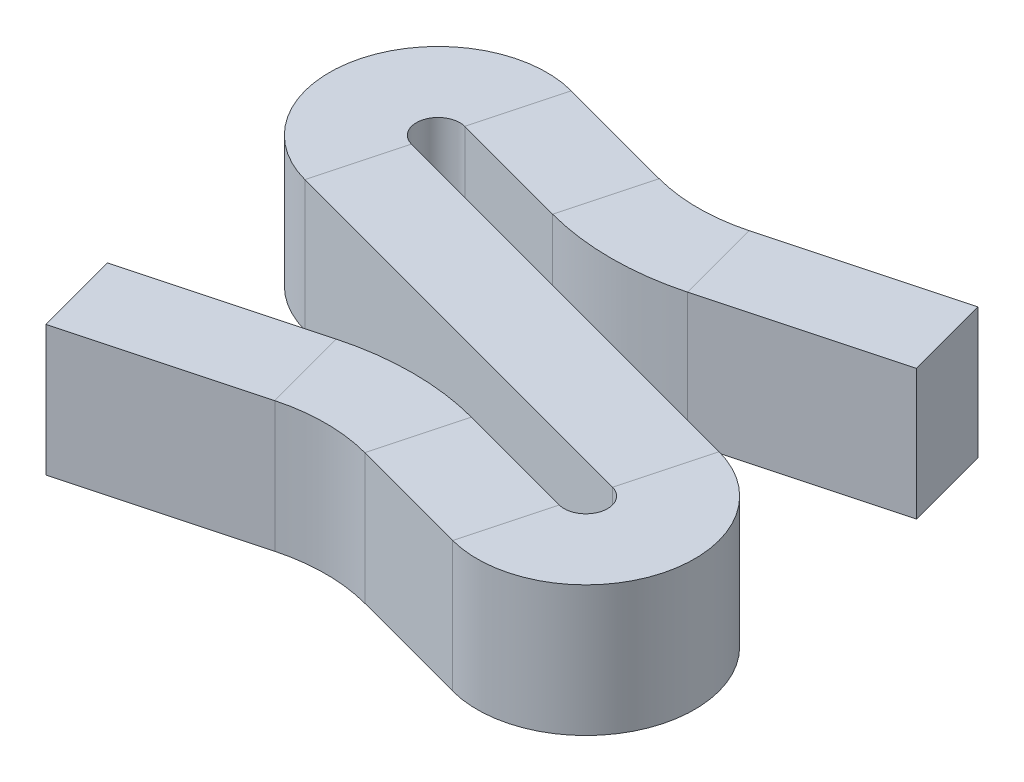
ISO-10303-21;
HEADER;
FILE_DESCRIPTION(('STEP AP214'),'2;1');
FILE_NAME('part.step','',(''),(''),'','','');
FILE_SCHEMA(('AUTOMOTIVE_DESIGN { 1 0 10303 214 1 1 1 1 }'));
ENDSEC;
DATA;
#1=APPLICATION_CONTEXT('core data for automotive mechanical design processes');
#2=APPLICATION_PROTOCOL_DEFINITION('international standard','automotive_design',2000,#1);
#3=PRODUCT_CONTEXT('',#1,'mechanical');
#4=PRODUCT('Part','Part','',(#3));
#5=PRODUCT_RELATED_PRODUCT_CATEGORY('part','',(#4));
#6=PRODUCT_DEFINITION_FORMATION('','',#4);
#7=PRODUCT_DEFINITION_CONTEXT('part definition',#1,'design');
#8=PRODUCT_DEFINITION('design','',#6,#7);
#9=PRODUCT_DEFINITION_SHAPE('','',#8);
#10=(LENGTH_UNIT() NAMED_UNIT(*) SI_UNIT(.MILLI.,.METRE.));
#11=(NAMED_UNIT(*) PLANE_ANGLE_UNIT() SI_UNIT($,.RADIAN.));
#12=(NAMED_UNIT(*) SI_UNIT($,.STERADIAN.) SOLID_ANGLE_UNIT());
#13=UNCERTAINTY_MEASURE_WITH_UNIT(LENGTH_MEASURE(1.E-05),#10,'distance_accuracy_value','');
#14=(GEOMETRIC_REPRESENTATION_CONTEXT(3) GLOBAL_UNCERTAINTY_ASSIGNED_CONTEXT((#13)) GLOBAL_UNIT_ASSIGNED_CONTEXT((#10,
#11,#12)) REPRESENTATION_CONTEXT('',''));
#15=CARTESIAN_POINT('',(0.,0.,0.));
#16=DIRECTION('',(0.,0.,1.));
#17=DIRECTION('',(1.,0.,0.));
#18=AXIS2_PLACEMENT_3D('',#15,#16,#17);
#19=CARTESIAN_POINT('',(4.66494342848403,0.,-7.46162490685962));
#20=DIRECTION('',(0.96592582628907,0.,-0.258819045102515));
#21=DIRECTION('',(-0.258819045102515,0.,-0.96592582628907));
#22=AXIS2_PLACEMENT_3D('',#19,#20,#21);
#23=PLANE('',#22);
#24=DIRECTION('',(0.,1.,0.));
#25=VECTOR('',#24,1.);
#26=CARTESIAN_POINT('',(5.70021960889409,-1.5,-3.59792160170334));
#27=LINE('',#26,#25);
#28=CARTESIAN_POINT('',(5.70021960889409,-1.5,-3.59792160170334));
#29=VERTEX_POINT('',#28);
#30=CARTESIAN_POINT('',(5.70021960889409,1.5,-3.59792160170334));
#31=VERTEX_POINT('',#30);
#32=EDGE_CURVE('E188',#29,#31,#27,.T.);
#33=ORIENTED_EDGE('',*,*,#32,.F.);
#34=DIRECTION('',(0.258819045102515,0.,0.96592582628907));
#35=VECTOR('',#34,1.);
#36=CARTESIAN_POINT('',(5.18258151868906,-1.5,-5.52977325428148));
#37=LINE('',#36,#35);
#38=CARTESIAN_POINT('',(5.18258151868906,-1.5,-5.52977325428148));
#39=VERTEX_POINT('',#38);
#40=EDGE_CURVE('E190',#39,#29,#37,.T.);
#41=ORIENTED_EDGE('',*,*,#40,.F.);
#42=DIRECTION('',(0.,-1.,0.));
#43=VECTOR('',#42,1.);
#44=CARTESIAN_POINT('',(5.18258151868906,-1.5,-5.52977325428148));
#45=LINE('',#44,#43);
#46=CARTESIAN_POINT('',(5.18258151868906,1.5,-5.52977325428148));
#47=VERTEX_POINT('',#46);
#48=EDGE_CURVE('E207',#47,#39,#45,.T.);
#49=ORIENTED_EDGE('',*,*,#48,.F.);
#50=DIRECTION('',(-0.258819045102515,0.,-0.96592582628907));
#51=VECTOR('',#50,1.);
#52=CARTESIAN_POINT('',(5.18258151868906,1.5,-5.52977325428148));
#53=LINE('',#52,#51);
#54=EDGE_CURVE('E193',#31,#47,#53,.T.);
#55=ORIENTED_EDGE('',*,*,#54,.F.);
#56=EDGE_LOOP('',(#33,#41,#49,#55));
#57=FACE_BOUND('',#56,.T.);
#58=ADVANCED_FACE('F32',(#57),#23,.T.);
#59=CARTESIAN_POINT('',(-6.21785769909912,0.,1.66606994912521));
#60=DIRECTION('',(0.96592582628907,0.,-0.258819045102515));
#61=DIRECTION('',(-0.258819045102515,0.,-0.96592582628907));
#62=AXIS2_PLACEMENT_3D('',#59,#60,#61);
#63=PLANE('',#62);
#64=DIRECTION('',(0.,1.,0.));
#65=VECTOR('',#64,1.);
#66=CARTESIAN_POINT('',(-5.18258151868906,-1.5,5.52977325428149));
#67=LINE('',#66,#65);
#68=CARTESIAN_POINT('',(-5.18258151868906,-1.5,5.52977325428149));
#69=VERTEX_POINT('',#68);
#70=CARTESIAN_POINT('',(-5.18258151868906,1.5,5.52977325428149));
#71=VERTEX_POINT('',#70);
#72=EDGE_CURVE('E293',#69,#71,#67,.T.);
#73=ORIENTED_EDGE('',*,*,#72,.T.);
#74=DIRECTION('',(-0.258819045102515,0.,-0.96592582628907));
#75=VECTOR('',#74,1.);
#76=CARTESIAN_POINT('',(-5.70021960889409,1.5,3.59792160170335));
#77=LINE('',#76,#75);
#78=CARTESIAN_POINT('',(-5.70021960889409,1.5,3.59792160170335));
#79=VERTEX_POINT('',#78);
#80=EDGE_CURVE('E51',#71,#79,#77,.T.);
#81=ORIENTED_EDGE('',*,*,#80,.T.);
#82=DIRECTION('',(0.,-1.,0.));
#83=VECTOR('',#82,1.);
#84=CARTESIAN_POINT('',(-5.70021960889409,-1.5,3.59792160170335));
#85=LINE('',#84,#83);
#86=CARTESIAN_POINT('',(-5.70021960889409,-1.5,3.59792160170335));
#87=VERTEX_POINT('',#86);
#88=EDGE_CURVE('E45',#79,#87,#85,.T.);
#89=ORIENTED_EDGE('',*,*,#88,.T.);
#90=DIRECTION('',(0.258819045102515,0.,0.96592582628907));
#91=VECTOR('',#90,1.);
#92=CARTESIAN_POINT('',(-5.70021960889409,-1.5,3.59792160170335));
#93=LINE('',#92,#91);
#94=EDGE_CURVE('E11',#87,#69,#93,.T.);
#95=ORIENTED_EDGE('',*,*,#94,.T.);
#96=EDGE_LOOP('',(#73,#81,#89,#95));
#97=FACE_BOUND('',#96,.T.);
#98=ADVANCED_FACE('F472',(#97),#63,.F.);
#99=CARTESIAN_POINT('',(5.70021960889409,-1.5,-3.59792160170334));
#100=DIRECTION('',(0.258819045102514,0.,0.96592582628907));
#101=DIRECTION('',(0.96592582628907,0.,-0.258819045102514));
#102=AXIS2_PLACEMENT_3D('',#99,#100,#101);
#103=PLANE('',#102);
#104=DIRECTION('',(-0.96592582628907,0.,0.258819045102514));
#105=VECTOR('',#104,1.);
#106=CARTESIAN_POINT('',(5.70021960889409,1.5,-3.59792160170334));
#107=LINE('',#106,#105);
#108=CARTESIAN_POINT('',(1.55291427061509,1.5,-2.48665448554623));
#109=VERTEX_POINT('',#108);
#110=EDGE_CURVE('E214',#31,#109,#107,.T.);
#111=ORIENTED_EDGE('',*,*,#110,.T.);
#112=DIRECTION('',(0.,1.,0.));
#113=VECTOR('',#112,1.);
#114=CARTESIAN_POINT('',(1.55291427061509,-1.5,-2.48665448554623));
#115=LINE('',#114,#113);
#116=CARTESIAN_POINT('',(1.55291427061509,-1.5,-2.48665448554623));
#117=VERTEX_POINT('',#116);
#118=EDGE_CURVE('E212',#117,#109,#115,.T.);
#119=ORIENTED_EDGE('',*,*,#118,.F.);
#120=DIRECTION('',(-0.96592582628907,0.,0.258819045102514));
#121=VECTOR('',#120,1.);
#122=CARTESIAN_POINT('',(5.70021960889409,-1.5,-3.59792160170334));
#123=LINE('',#122,#121);
#124=EDGE_CURVE('E204',#29,#117,#123,.T.);
#125=ORIENTED_EDGE('',*,*,#124,.F.);
#126=ORIENTED_EDGE('',*,*,#32,.T.);
#127=EDGE_LOOP('',(#111,#119,#125,#126));
#128=FACE_BOUND('',#127,.T.);
#129=ADVANCED_FACE('F210',(#128),#103,.T.);
#130=CARTESIAN_POINT('',(5.18258151868906,1.5,-5.52977325428148));
#131=DIRECTION('',(0.,1.,0.));
#132=DIRECTION('',(0.,0.,1.));
#133=AXIS2_PLACEMENT_3D('',#130,#131,#132);
#134=PLANE('',#133);
#135=DIRECTION('',(-0.96592582628907,0.,0.258819045102514));
#136=VECTOR('',#135,1.);
#137=CARTESIAN_POINT('',(5.18258151868906,1.5,-5.52977325428148));
#138=LINE('',#137,#136);
#139=CARTESIAN_POINT('',(1.03527618041006,1.5,-4.41850613812437));
#140=VERTEX_POINT('',#139);
#141=EDGE_CURVE('E304',#47,#140,#138,.T.);
#142=ORIENTED_EDGE('',*,*,#141,.T.);
#143=DIRECTION('',(-0.258819045102515,0.,-0.96592582628907));
#144=VECTOR('',#143,1.);
#145=CARTESIAN_POINT('',(1.03527618041006,1.5,-4.41850613812437));
#146=LINE('',#145,#144);
#147=EDGE_CURVE('E301',#109,#140,#146,.T.);
#148=ORIENTED_EDGE('',*,*,#147,.F.);
#149=ORIENTED_EDGE('',*,*,#110,.F.);
#150=ORIENTED_EDGE('',*,*,#54,.T.);
#151=EDGE_LOOP('',(#142,#148,#149,#150));
#152=FACE_BOUND('',#151,.T.);
#153=ADVANCED_FACE('F512',(#152),#134,.T.);
#154=CARTESIAN_POINT('',(5.18258151868906,-1.5,-5.52977325428148));
#155=DIRECTION('',(-0.258819045102514,0.,-0.96592582628907));
#156=DIRECTION('',(-0.96592582628907,0.,0.258819045102514));
#157=AXIS2_PLACEMENT_3D('',#154,#155,#156);
#158=PLANE('',#157);
#159=DIRECTION('',(-0.96592582628907,0.,0.258819045102514));
#160=VECTOR('',#159,1.);
#161=CARTESIAN_POINT('',(5.18258151868906,-1.5,-5.52977325428148));
#162=LINE('',#161,#160);
#163=CARTESIAN_POINT('',(1.03527618041006,-1.5,-4.41850613812437));
#164=VERTEX_POINT('',#163);
#165=EDGE_CURVE('E206',#39,#164,#162,.T.);
#166=ORIENTED_EDGE('',*,*,#165,.T.);
#167=DIRECTION('',(0.,-1.,0.));
#168=VECTOR('',#167,1.);
#169=CARTESIAN_POINT('',(1.03527618041006,-1.5,-4.41850613812437));
#170=LINE('',#169,#168);
#171=EDGE_CURVE('E307',#140,#164,#170,.T.);
#172=ORIENTED_EDGE('',*,*,#171,.F.);
#173=ORIENTED_EDGE('',*,*,#141,.F.);
#174=ORIENTED_EDGE('',*,*,#48,.T.);
#175=EDGE_LOOP('',(#166,#172,#173,#174));
#176=FACE_BOUND('',#175,.T.);
#177=ADVANCED_FACE('F445',(#176),#158,.T.);
#178=CARTESIAN_POINT('',(5.18258151868906,-1.5,-5.52977325428148));
#179=DIRECTION('',(0.,-1.,0.));
#180=DIRECTION('',(0.,0.,-1.));
#181=AXIS2_PLACEMENT_3D('',#178,#179,#180);
#182=PLANE('',#181);
#183=DIRECTION('',(0.258819045102515,0.,0.96592582628907));
#184=VECTOR('',#183,1.);
#185=CARTESIAN_POINT('',(1.03527618041006,-1.5,-4.41850613812437));
#186=LINE('',#185,#184);
#187=EDGE_CURVE('E228',#164,#117,#186,.T.);
#188=ORIENTED_EDGE('',*,*,#187,.F.);
#189=ORIENTED_EDGE('',*,*,#165,.F.);
#190=ORIENTED_EDGE('',*,*,#40,.T.);
#191=ORIENTED_EDGE('',*,*,#124,.T.);
#192=EDGE_LOOP('',(#188,#189,#190,#191));
#193=FACE_BOUND('',#192,.T.);
#194=ADVANCED_FACE('F203',(#193),#182,.T.);
#195=CARTESIAN_POINT('',(0.,0.,-8.28220944328065));
#196=DIRECTION('',(0.,-1.,0.));
#197=DIRECTION('',(0.,0.,-1.));
#198=AXIS2_PLACEMENT_3D('',#195,#196,#197);
#199=CYLINDRICAL_SURFACE('',#198,5.99999999999999);
#200=CARTESIAN_POINT('',(0.,1.5,-8.28220944328065));
#201=DIRECTION('',(0.,-1.,0.));
#202=DIRECTION('',(0.258819045102515,0.,0.96592582628907));
#203=AXIS2_PLACEMENT_3D('',#200,#201,#202);
#204=CIRCLE('',#203,5.99999999999999);
#205=CARTESIAN_POINT('',(-1.55291427061508,1.5,-2.48665448554624));
#206=VERTEX_POINT('',#205);
#207=EDGE_CURVE('E221',#109,#206,#204,.T.);
#208=ORIENTED_EDGE('',*,*,#207,.T.);
#209=DIRECTION('',(0.,1.,0.));
#210=VECTOR('',#209,1.);
#211=CARTESIAN_POINT('',(-1.55291427061509,-1.5,-2.48665448554623));
#212=LINE('',#211,#210);
#213=CARTESIAN_POINT('',(-1.55291427061508,-1.5,-2.48665448554624));
#214=VERTEX_POINT('',#213);
#215=EDGE_CURVE('E218',#214,#206,#212,.T.);
#216=ORIENTED_EDGE('',*,*,#215,.F.);
#217=CARTESIAN_POINT('',(0.,-1.5,-8.28220944328065));
#218=DIRECTION('',(0.,-1.,0.));
#219=DIRECTION('',(0.258819045102515,0.,0.96592582628907));
#220=AXIS2_PLACEMENT_3D('',#217,#218,#219);
#221=CIRCLE('',#220,5.99999999999999);
#222=EDGE_CURVE('E222',#117,#214,#221,.T.);
#223=ORIENTED_EDGE('',*,*,#222,.F.);
#224=ORIENTED_EDGE('',*,*,#118,.T.);
#225=EDGE_LOOP('',(#208,#216,#223,#224));
#226=FACE_BOUND('',#225,.T.);
#227=ADVANCED_FACE('F441',(#226),#199,.T.);
#228=CARTESIAN_POINT('',(1.03527618041005,1.5,-4.41850613812438));
#229=DIRECTION('',(0.,1.,0.));
#230=DIRECTION('',(0.,0.,1.));
#231=AXIS2_PLACEMENT_3D('',#228,#229,#230);
#232=PLANE('',#231);
#233=CARTESIAN_POINT('',(0.,1.5,-8.28220944328065));
#234=DIRECTION('',(0.,-1.,0.));
#235=DIRECTION('',(0.258819045102515,0.,0.96592582628907));
#236=AXIS2_PLACEMENT_3D('',#233,#234,#235);
#237=CIRCLE('',#236,3.99999999999999);
#238=CARTESIAN_POINT('',(-1.03527618041006,1.5,-4.41850613812438));
#239=VERTEX_POINT('',#238);
#240=EDGE_CURVE('E310',#140,#239,#237,.T.);
#241=ORIENTED_EDGE('',*,*,#240,.T.);
#242=DIRECTION('',(0.258819045102513,0.,-0.96592582628907));
#243=VECTOR('',#242,1.);
#244=CARTESIAN_POINT('',(-1.03527618041006,1.5,-4.41850613812437));
#245=LINE('',#244,#243);
#246=EDGE_CURVE('E225',#206,#239,#245,.T.);
#247=ORIENTED_EDGE('',*,*,#246,.F.);
#248=ORIENTED_EDGE('',*,*,#207,.F.);
#249=ORIENTED_EDGE('',*,*,#147,.T.);
#250=EDGE_LOOP('',(#241,#247,#248,#249));
#251=FACE_BOUND('',#250,.T.);
#252=ADVANCED_FACE('F452',(#251),#232,.T.);
#253=CARTESIAN_POINT('',(0.,0.,-8.28220944328065));
#254=DIRECTION('',(0.,-1.,0.));
#255=DIRECTION('',(0.,0.,-1.));
#256=AXIS2_PLACEMENT_3D('',#253,#254,#255);
#257=CYLINDRICAL_SURFACE('',#256,3.99999999999999);
#258=CARTESIAN_POINT('',(0.,-1.5,-8.28220944328065));
#259=DIRECTION('',(0.,-1.,0.));
#260=DIRECTION('',(0.258819045102515,0.,0.96592582628907));
#261=AXIS2_PLACEMENT_3D('',#258,#259,#260);
#262=CIRCLE('',#261,3.99999999999999);
#263=CARTESIAN_POINT('',(-1.03527618041006,-1.5,-4.41850613812438));
#264=VERTEX_POINT('',#263);
#265=EDGE_CURVE('E354',#164,#264,#262,.T.);
#266=ORIENTED_EDGE('',*,*,#265,.T.);
#267=DIRECTION('',(0.,-1.,0.));
#268=VECTOR('',#267,1.);
#269=CARTESIAN_POINT('',(-1.03527618041006,-1.5,-4.41850613812437));
#270=LINE('',#269,#268);
#271=EDGE_CURVE('E313',#239,#264,#270,.T.);
#272=ORIENTED_EDGE('',*,*,#271,.F.);
#273=ORIENTED_EDGE('',*,*,#240,.F.);
#274=ORIENTED_EDGE('',*,*,#171,.T.);
#275=EDGE_LOOP('',(#266,#272,#273,#274));
#276=FACE_BOUND('',#275,.T.);
#277=ADVANCED_FACE('F448',(#276),#257,.F.);
#278=CARTESIAN_POINT('',(1.03527618041005,-1.5,-4.41850613812438));
#279=DIRECTION('',(0.,-1.,0.));
#280=DIRECTION('',(0.,0.,-1.));
#281=AXIS2_PLACEMENT_3D('',#278,#279,#280);
#282=PLANE('',#281);
#283=DIRECTION('',(-0.258819045102513,0.,0.96592582628907));
#284=VECTOR('',#283,1.);
#285=CARTESIAN_POINT('',(-1.03527618041006,-1.5,-4.41850613812437));
#286=LINE('',#285,#284);
#287=EDGE_CURVE('E239',#264,#214,#286,.T.);
#288=ORIENTED_EDGE('',*,*,#287,.F.);
#289=ORIENTED_EDGE('',*,*,#265,.F.);
#290=ORIENTED_EDGE('',*,*,#187,.T.);
#291=ORIENTED_EDGE('',*,*,#222,.T.);
#292=EDGE_LOOP('',(#288,#289,#290,#291));
#293=FACE_BOUND('',#292,.T.);
#294=ADVANCED_FACE('F442',(#293),#282,.T.);
#295=CARTESIAN_POINT('',(-1.55291427061509,-1.5,-2.48665448554623));
#296=DIRECTION('',(-0.258819045102514,0.,0.96592582628907));
#297=DIRECTION('',(0.96592582628907,0.,0.258819045102514));
#298=AXIS2_PLACEMENT_3D('',#295,#296,#297);
#299=PLANE('',#298);
#300=DIRECTION('',(-0.96592582628907,0.,-0.258819045102514));
#301=VECTOR('',#300,1.);
#302=CARTESIAN_POINT('',(-1.55291427061509,1.5,-2.48665448554623));
#303=LINE('',#302,#301);
#304=CARTESIAN_POINT('',(-4.31199104124032,1.5,-3.22594687809071));
#305=VERTEX_POINT('',#304);
#306=EDGE_CURVE('E232',#206,#305,#303,.T.);
#307=ORIENTED_EDGE('',*,*,#306,.T.);
#308=DIRECTION('',(0.,1.,0.));
#309=VECTOR('',#308,1.);
#310=CARTESIAN_POINT('',(-4.31199104124032,-1.5,-3.22594687809071));
#311=LINE('',#310,#309);
#312=CARTESIAN_POINT('',(-4.31199104124032,-1.5,-3.22594687809071));
#313=VERTEX_POINT('',#312);
#314=EDGE_CURVE('E229',#313,#305,#311,.T.);
#315=ORIENTED_EDGE('',*,*,#314,.F.);
#316=DIRECTION('',(-0.96592582628907,0.,-0.258819045102514));
#317=VECTOR('',#316,1.);
#318=CARTESIAN_POINT('',(-1.55291427061509,-1.5,-2.48665448554623));
#319=LINE('',#318,#317);
#320=EDGE_CURVE('E233',#214,#313,#319,.T.);
#321=ORIENTED_EDGE('',*,*,#320,.F.);
#322=ORIENTED_EDGE('',*,*,#215,.T.);
#323=EDGE_LOOP('',(#307,#315,#321,#322));
#324=FACE_BOUND('',#323,.T.);
#325=ADVANCED_FACE('F435',(#324),#299,.T.);
#326=CARTESIAN_POINT('',(-1.03527618041006,1.5,-4.41850613812437));
#327=DIRECTION('',(0.,1.,0.));
#328=DIRECTION('',(0.,0.,1.));
#329=AXIS2_PLACEMENT_3D('',#326,#327,#328);
#330=PLANE('',#329);
#331=DIRECTION('',(-0.96592582628907,0.,-0.258819045102514));
#332=VECTOR('',#331,1.);
#333=CARTESIAN_POINT('',(-1.03527618041006,1.5,-4.41850613812437));
#334=LINE('',#333,#332);
#335=CARTESIAN_POINT('',(-3.7943529510353,1.5,-5.15779853066885));
#336=VERTEX_POINT('',#335);
#337=EDGE_CURVE('E316',#239,#336,#334,.T.);
#338=ORIENTED_EDGE('',*,*,#337,.T.);
#339=DIRECTION('',(0.258819045102513,0.,-0.96592582628907));
#340=VECTOR('',#339,1.);
#341=CARTESIAN_POINT('',(-3.7943529510353,1.5,-5.15779853066885));
#342=LINE('',#341,#340);
#343=EDGE_CURVE('E236',#305,#336,#342,.T.);
#344=ORIENTED_EDGE('',*,*,#343,.F.);
#345=ORIENTED_EDGE('',*,*,#306,.F.);
#346=ORIENTED_EDGE('',*,*,#246,.T.);
#347=EDGE_LOOP('',(#338,#344,#345,#346));
#348=FACE_BOUND('',#347,.T.);
#349=ADVANCED_FACE('F455',(#348),#330,.T.);
#350=CARTESIAN_POINT('',(-1.03527618041006,-1.5,-4.41850613812437));
#351=DIRECTION('',(0.258819045102514,0.,-0.96592582628907));
#352=DIRECTION('',(-0.96592582628907,0.,-0.258819045102514));
#353=AXIS2_PLACEMENT_3D('',#350,#351,#352);
#354=PLANE('',#353);
#355=DIRECTION('',(-0.96592582628907,0.,-0.258819045102514));
#356=VECTOR('',#355,1.);
#357=CARTESIAN_POINT('',(-1.03527618041006,-1.5,-4.41850613812437));
#358=LINE('',#357,#356);
#359=CARTESIAN_POINT('',(-3.7943529510353,-1.5,-5.15779853066885));
#360=VERTEX_POINT('',#359);
#361=EDGE_CURVE('E359',#264,#360,#358,.T.);
#362=ORIENTED_EDGE('',*,*,#361,.T.);
#363=DIRECTION('',(0.,-1.,0.));
#364=VECTOR('',#363,1.);
#365=CARTESIAN_POINT('',(-3.7943529510353,-1.5,-5.15779853066885));
#366=LINE('',#365,#364);
#367=EDGE_CURVE('E319',#336,#360,#366,.T.);
#368=ORIENTED_EDGE('',*,*,#367,.F.);
#369=ORIENTED_EDGE('',*,*,#337,.F.);
#370=ORIENTED_EDGE('',*,*,#271,.T.);
#371=EDGE_LOOP('',(#362,#368,#369,#370));
#372=FACE_BOUND('',#371,.T.);
#373=ADVANCED_FACE('F488',(#372),#354,.T.);
#374=CARTESIAN_POINT('',(-1.03527618041006,-1.5,-4.41850613812437));
#375=DIRECTION('',(0.,-1.,0.));
#376=DIRECTION('',(0.,0.,-1.));
#377=AXIS2_PLACEMENT_3D('',#374,#375,#376);
#378=PLANE('',#377);
#379=DIRECTION('',(-0.258819045102513,0.,0.96592582628907));
#380=VECTOR('',#379,1.);
#381=CARTESIAN_POINT('',(-3.7943529510353,-1.5,-5.15779853066885));
#382=LINE('',#381,#380);
#383=EDGE_CURVE('E250',#360,#313,#382,.T.);
#384=ORIENTED_EDGE('',*,*,#383,.F.);
#385=ORIENTED_EDGE('',*,*,#361,.F.);
#386=ORIENTED_EDGE('',*,*,#287,.T.);
#387=ORIENTED_EDGE('',*,*,#320,.T.);
#388=EDGE_LOOP('',(#384,#385,#386,#387));
#389=FACE_BOUND('',#388,.T.);
#390=ADVANCED_FACE('F436',(#389),#378,.T.);
#391=CARTESIAN_POINT('',(-4.44140056379161,0.,-2.74298396494618));
#392=DIRECTION('',(0.,1.,0.));
#393=DIRECTION('',(0.,0.,1.));
#394=AXIS2_PLACEMENT_3D('',#391,#392,#393);
#395=CYLINDRICAL_SURFACE('',#394,0.499999999999997);
#396=CARTESIAN_POINT('',(-4.44140056379161,1.5,-2.74298396494618));
#397=DIRECTION('',(0.,1.,0.));
#398=DIRECTION('',(0.25881904510253,0.,-0.965925826289066));
#399=AXIS2_PLACEMENT_3D('',#396,#397,#398);
#400=CIRCLE('',#399,0.499999999999997);
#401=CARTESIAN_POINT('',(-4.57081008634286,1.5,-2.26002105180165));
#402=VERTEX_POINT('',#401);
#403=EDGE_CURVE('E243',#305,#402,#400,.T.);
#404=ORIENTED_EDGE('',*,*,#403,.T.);
#405=DIRECTION('',(0.,1.,0.));
#406=VECTOR('',#405,1.);
#407=CARTESIAN_POINT('',(-4.57081008634286,-1.5,-2.26002105180165));
#408=LINE('',#407,#406);
#409=CARTESIAN_POINT('',(-4.57081008634286,-1.5,-2.26002105180165));
#410=VERTEX_POINT('',#409);
#411=EDGE_CURVE('E240',#410,#402,#408,.T.);
#412=ORIENTED_EDGE('',*,*,#411,.F.);
#413=CARTESIAN_POINT('',(-4.44140056379161,-1.5,-2.74298396494618));
#414=DIRECTION('',(0.,1.,0.));
#415=DIRECTION('',(0.25881904510253,0.,-0.965925826289066));
#416=AXIS2_PLACEMENT_3D('',#413,#414,#415);
#417=CIRCLE('',#416,0.499999999999997);
#418=EDGE_CURVE('E244',#313,#410,#417,.T.);
#419=ORIENTED_EDGE('',*,*,#418,.F.);
#420=ORIENTED_EDGE('',*,*,#314,.T.);
#421=EDGE_LOOP('',(#404,#412,#419,#420));
#422=FACE_BOUND('',#421,.T.);
#423=ADVANCED_FACE('F429',(#422),#395,.F.);
#424=CARTESIAN_POINT('',(-3.79435295103527,1.5,-5.15779853066884));
#425=DIRECTION('',(0.,1.,0.));
#426=DIRECTION('',(0.,0.,1.));
#427=AXIS2_PLACEMENT_3D('',#424,#425,#426);
#428=PLANE('',#427);
#429=CARTESIAN_POINT('',(-4.44140056379161,1.5,-2.74298396494618));
#430=DIRECTION('',(0.,1.,0.));
#431=DIRECTION('',(0.258819045102534,0.,-0.965925826289065));
#432=AXIS2_PLACEMENT_3D('',#429,#430,#431);
#433=CIRCLE('',#432,2.5);
#434=CARTESIAN_POINT('',(-5.08844817654785,1.5,-0.328169399223499));
#435=VERTEX_POINT('',#434);
#436=EDGE_CURVE('E322',#336,#435,#433,.T.);
#437=ORIENTED_EDGE('',*,*,#436,.T.);
#438=DIRECTION('',(-0.258819045102498,0.,0.965925826289074));
#439=VECTOR('',#438,1.);
#440=CARTESIAN_POINT('',(-5.08844817654785,1.5,-0.328169399223498));
#441=LINE('',#440,#439);
#442=EDGE_CURVE('E247',#402,#435,#441,.T.);
#443=ORIENTED_EDGE('',*,*,#442,.F.);
#444=ORIENTED_EDGE('',*,*,#403,.F.);
#445=ORIENTED_EDGE('',*,*,#343,.T.);
#446=EDGE_LOOP('',(#437,#443,#444,#445));
#447=FACE_BOUND('',#446,.T.);
#448=ADVANCED_FACE('F458',(#447),#428,.T.);
#449=CARTESIAN_POINT('',(-4.44140056379161,0.,-2.74298396494618));
#450=DIRECTION('',(0.,1.,0.));
#451=DIRECTION('',(0.,0.,1.));
#452=AXIS2_PLACEMENT_3D('',#449,#450,#451);
#453=CYLINDRICAL_SURFACE('',#452,2.5);
#454=CARTESIAN_POINT('',(-4.44140056379161,-1.5,-2.74298396494618));
#455=DIRECTION('',(0.,1.,0.));
#456=DIRECTION('',(0.258819045102534,0.,-0.965925826289065));
#457=AXIS2_PLACEMENT_3D('',#454,#455,#456);
#458=CIRCLE('',#457,2.5);
#459=CARTESIAN_POINT('',(-5.08844817654785,-1.5,-0.328169399223499));
#460=VERTEX_POINT('',#459);
#461=EDGE_CURVE('E364',#360,#460,#458,.T.);
#462=ORIENTED_EDGE('',*,*,#461,.T.);
#463=DIRECTION('',(0.,-1.,0.));
#464=VECTOR('',#463,1.);
#465=CARTESIAN_POINT('',(-5.08844817654785,-1.5,-0.328169399223498));
#466=LINE('',#465,#464);
#467=EDGE_CURVE('E325',#435,#460,#466,.T.);
#468=ORIENTED_EDGE('',*,*,#467,.F.);
#469=ORIENTED_EDGE('',*,*,#436,.F.);
#470=ORIENTED_EDGE('',*,*,#367,.T.);
#471=EDGE_LOOP('',(#462,#468,#469,#470));
#472=FACE_BOUND('',#471,.T.);
#473=ADVANCED_FACE('F485',(#472),#453,.T.);
#474=CARTESIAN_POINT('',(-3.79435295103527,-1.5,-5.15779853066884));
#475=DIRECTION('',(0.,-1.,0.));
#476=DIRECTION('',(0.,0.,-1.));
#477=AXIS2_PLACEMENT_3D('',#474,#475,#476);
#478=PLANE('',#477);
#479=DIRECTION('',(0.258819045102498,0.,-0.965925826289074));
#480=VECTOR('',#479,1.);
#481=CARTESIAN_POINT('',(-5.08844817654785,-1.5,-0.328169399223498));
#482=LINE('',#481,#480);
#483=EDGE_CURVE('E261',#460,#410,#482,.T.);
#484=ORIENTED_EDGE('',*,*,#483,.F.);
#485=ORIENTED_EDGE('',*,*,#461,.F.);
#486=ORIENTED_EDGE('',*,*,#383,.T.);
#487=ORIENTED_EDGE('',*,*,#418,.T.);
#488=EDGE_LOOP('',(#484,#485,#486,#487));
#489=FACE_BOUND('',#488,.T.);
#490=ADVANCED_FACE('F430',(#489),#478,.T.);
#491=CARTESIAN_POINT('',(-4.57081008634284,-1.5,-2.26002105180165));
#492=DIRECTION('',(0.258819045102515,0.,-0.96592582628907));
#493=DIRECTION('',(-0.96592582628907,0.,-0.258819045102515));
#494=AXIS2_PLACEMENT_3D('',#491,#492,#493);
#495=PLANE('',#494);
#496=DIRECTION('',(0.96592582628907,0.,0.258819045102515));
#497=VECTOR('',#496,1.);
#498=CARTESIAN_POINT('',(-4.57081008634284,1.5,-2.26002105180165));
#499=LINE('',#498,#497);
#500=CARTESIAN_POINT('',(5.08844817654788,1.5,0.328169399223505));
#501=VERTEX_POINT('',#500);
#502=EDGE_CURVE('E254',#402,#501,#499,.T.);
#503=ORIENTED_EDGE('',*,*,#502,.T.);
#504=DIRECTION('',(0.,1.,0.));
#505=VECTOR('',#504,1.);
#506=CARTESIAN_POINT('',(5.08844817654788,-1.5,0.328169399223505));
#507=LINE('',#506,#505);
#508=CARTESIAN_POINT('',(5.08844817654788,-1.5,0.328169399223505));
#509=VERTEX_POINT('',#508);
#510=EDGE_CURVE('E251',#509,#501,#507,.T.);
#511=ORIENTED_EDGE('',*,*,#510,.F.);
#512=DIRECTION('',(0.96592582628907,0.,0.258819045102515));
#513=VECTOR('',#512,1.);
#514=CARTESIAN_POINT('',(-4.57081008634284,-1.5,-2.26002105180165));
#515=LINE('',#514,#513);
#516=EDGE_CURVE('E255',#410,#509,#515,.T.);
#517=ORIENTED_EDGE('',*,*,#516,.F.);
#518=ORIENTED_EDGE('',*,*,#411,.T.);
#519=EDGE_LOOP('',(#503,#511,#517,#518));
#520=FACE_BOUND('',#519,.T.);
#521=ADVANCED_FACE('F423',(#520),#495,.T.);
#522=CARTESIAN_POINT('',(-5.08844817654787,1.5,-0.328169399223507));
#523=DIRECTION('',(0.,1.,0.));
#524=DIRECTION('',(0.,0.,1.));
#525=AXIS2_PLACEMENT_3D('',#522,#523,#524);
#526=PLANE('',#525);
#527=DIRECTION('',(0.96592582628907,0.,0.258819045102515));
#528=VECTOR('',#527,1.);
#529=CARTESIAN_POINT('',(-5.08844817654787,1.5,-0.328169399223507));
#530=LINE('',#529,#528);
#531=CARTESIAN_POINT('',(4.57081008634285,1.5,2.26002105180165));
#532=VERTEX_POINT('',#531);
#533=EDGE_CURVE('E328',#435,#532,#530,.T.);
#534=ORIENTED_EDGE('',*,*,#533,.T.);
#535=DIRECTION('',(-0.258819045102515,0.,0.96592582628907));
#536=VECTOR('',#535,1.);
#537=CARTESIAN_POINT('',(4.57081008634285,1.5,2.26002105180165));
#538=LINE('',#537,#536);
#539=EDGE_CURVE('E258',#501,#532,#538,.T.);
#540=ORIENTED_EDGE('',*,*,#539,.F.);
#541=ORIENTED_EDGE('',*,*,#502,.F.);
#542=ORIENTED_EDGE('',*,*,#442,.T.);
#543=EDGE_LOOP('',(#534,#540,#541,#542));
#544=FACE_BOUND('',#543,.T.);
#545=ADVANCED_FACE('F461',(#544),#526,.T.);
#546=CARTESIAN_POINT('',(-5.08844817654787,-1.5,-0.328169399223507));
#547=DIRECTION('',(-0.258819045102515,0.,0.96592582628907));
#548=DIRECTION('',(0.96592582628907,0.,0.258819045102515));
#549=AXIS2_PLACEMENT_3D('',#546,#547,#548);
#550=PLANE('',#549);
#551=DIRECTION('',(0.96592582628907,0.,0.258819045102515));
#552=VECTOR('',#551,1.);
#553=CARTESIAN_POINT('',(-5.08844817654787,-1.5,-0.328169399223507));
#554=LINE('',#553,#552);
#555=CARTESIAN_POINT('',(4.57081008634285,-1.5,2.26002105180165));
#556=VERTEX_POINT('',#555);
#557=EDGE_CURVE('E369',#460,#556,#554,.T.);
#558=ORIENTED_EDGE('',*,*,#557,.T.);
#559=DIRECTION('',(0.,-1.,0.));
#560=VECTOR('',#559,1.);
#561=CARTESIAN_POINT('',(4.57081008634285,-1.5,2.26002105180165));
#562=LINE('',#561,#560);
#563=EDGE_CURVE('E331',#532,#556,#562,.T.);
#564=ORIENTED_EDGE('',*,*,#563,.F.);
#565=ORIENTED_EDGE('',*,*,#533,.F.);
#566=ORIENTED_EDGE('',*,*,#467,.T.);
#567=EDGE_LOOP('',(#558,#564,#565,#566));
#568=FACE_BOUND('',#567,.T.);
#569=ADVANCED_FACE('F482',(#568),#550,.T.);
#570=CARTESIAN_POINT('',(-5.08844817654787,-1.5,-0.328169399223507));
#571=DIRECTION('',(0.,-1.,0.));
#572=DIRECTION('',(0.,0.,-1.));
#573=AXIS2_PLACEMENT_3D('',#570,#571,#572);
#574=PLANE('',#573);
#575=DIRECTION('',(0.258819045102515,0.,-0.96592582628907));
#576=VECTOR('',#575,1.);
#577=CARTESIAN_POINT('',(4.57081008634285,-1.5,2.26002105180165));
#578=LINE('',#577,#576);
#579=EDGE_CURVE('E272',#556,#509,#578,.T.);
#580=ORIENTED_EDGE('',*,*,#579,.F.);
#581=ORIENTED_EDGE('',*,*,#557,.F.);
#582=ORIENTED_EDGE('',*,*,#483,.T.);
#583=ORIENTED_EDGE('',*,*,#516,.T.);
#584=EDGE_LOOP('',(#580,#581,#582,#583));
#585=FACE_BOUND('',#584,.T.);
#586=ADVANCED_FACE('F424',(#585),#574,.T.);
#587=CARTESIAN_POINT('',(4.44140056379158,0.,2.74298396494618));
#588=DIRECTION('',(0.,-1.,0.));
#589=DIRECTION('',(0.,0.,-1.));
#590=AXIS2_PLACEMENT_3D('',#587,#588,#589);
#591=CYLINDRICAL_SURFACE('',#590,2.5);
#592=CARTESIAN_POINT('',(4.44140056379158,1.5,2.74298396494618));
#593=DIRECTION('',(0.,-1.,0.));
#594=DIRECTION('',(0.258819045102522,0.,-0.965925826289068));
#595=AXIS2_PLACEMENT_3D('',#592,#593,#594);
#596=CIRCLE('',#595,2.5);
#597=CARTESIAN_POINT('',(3.79435295103529,1.5,5.15779853066885));
#598=VERTEX_POINT('',#597);
#599=EDGE_CURVE('E265',#501,#598,#596,.T.);
#600=ORIENTED_EDGE('',*,*,#599,.T.);
#601=DIRECTION('',(0.,1.,0.));
#602=VECTOR('',#601,1.);
#603=CARTESIAN_POINT('',(3.79435295103529,-1.5,5.15779853066885));
#604=LINE('',#603,#602);
#605=CARTESIAN_POINT('',(3.79435295103529,-1.5,5.15779853066885));
#606=VERTEX_POINT('',#605);
#607=EDGE_CURVE('E262',#606,#598,#604,.T.);
#608=ORIENTED_EDGE('',*,*,#607,.F.);
#609=CARTESIAN_POINT('',(4.44140056379158,-1.5,2.74298396494618));
#610=DIRECTION('',(0.,-1.,0.));
#611=DIRECTION('',(0.258819045102522,0.,-0.965925826289068));
#612=AXIS2_PLACEMENT_3D('',#609,#610,#611);
#613=CIRCLE('',#612,2.5);
#614=EDGE_CURVE('E266',#509,#606,#613,.T.);
#615=ORIENTED_EDGE('',*,*,#614,.F.);
#616=ORIENTED_EDGE('',*,*,#510,.T.);
#617=EDGE_LOOP('',(#600,#608,#615,#616));
#618=FACE_BOUND('',#617,.T.);
#619=ADVANCED_FACE('F417',(#618),#591,.T.);
#620=CARTESIAN_POINT('',(4.57081008634284,1.5,2.26002105180164));
#621=DIRECTION('',(0.,1.,0.));
#622=DIRECTION('',(0.,0.,1.));
#623=AXIS2_PLACEMENT_3D('',#620,#621,#622);
#624=PLANE('',#623);
#625=CARTESIAN_POINT('',(4.44140056379158,1.5,2.74298396494618));
#626=DIRECTION('',(0.,-1.,0.));
#627=DIRECTION('',(0.258819045102526,0.,-0.965925826289067));
#628=AXIS2_PLACEMENT_3D('',#625,#626,#627);
#629=CIRCLE('',#628,0.5);
#630=CARTESIAN_POINT('',(4.31199104124032,1.5,3.22594687809071));
#631=VERTEX_POINT('',#630);
#632=EDGE_CURVE('E334',#532,#631,#629,.T.);
#633=ORIENTED_EDGE('',*,*,#632,.T.);
#634=DIRECTION('',(0.258819045102514,0.,-0.96592582628907));
#635=VECTOR('',#634,1.);
#636=CARTESIAN_POINT('',(4.31199104124032,1.5,3.22594687809071));
#637=LINE('',#636,#635);
#638=EDGE_CURVE('E269',#598,#631,#637,.T.);
#639=ORIENTED_EDGE('',*,*,#638,.F.);
#640=ORIENTED_EDGE('',*,*,#599,.F.);
#641=ORIENTED_EDGE('',*,*,#539,.T.);
#642=EDGE_LOOP('',(#633,#639,#640,#641));
#643=FACE_BOUND('',#642,.T.);
#644=ADVANCED_FACE('F464',(#643),#624,.T.);
#645=CARTESIAN_POINT('',(4.44140056379158,0.,2.74298396494618));
#646=DIRECTION('',(0.,-1.,0.));
#647=DIRECTION('',(0.,0.,-1.));
#648=AXIS2_PLACEMENT_3D('',#645,#646,#647);
#649=CYLINDRICAL_SURFACE('',#648,0.5);
#650=CARTESIAN_POINT('',(4.44140056379158,-1.5,2.74298396494618));
#651=DIRECTION('',(0.,-1.,0.));
#652=DIRECTION('',(0.258819045102526,0.,-0.965925826289067));
#653=AXIS2_PLACEMENT_3D('',#650,#651,#652);
#654=CIRCLE('',#653,0.5);
#655=CARTESIAN_POINT('',(4.31199104124032,-1.5,3.22594687809071));
#656=VERTEX_POINT('',#655);
#657=EDGE_CURVE('E374',#556,#656,#654,.T.);
#658=ORIENTED_EDGE('',*,*,#657,.T.);
#659=DIRECTION('',(0.,-1.,0.));
#660=VECTOR('',#659,1.);
#661=CARTESIAN_POINT('',(4.31199104124032,-1.5,3.22594687809071));
#662=LINE('',#661,#660);
#663=EDGE_CURVE('E337',#631,#656,#662,.T.);
#664=ORIENTED_EDGE('',*,*,#663,.F.);
#665=ORIENTED_EDGE('',*,*,#632,.F.);
#666=ORIENTED_EDGE('',*,*,#563,.T.);
#667=EDGE_LOOP('',(#658,#664,#665,#666));
#668=FACE_BOUND('',#667,.T.);
#669=ADVANCED_FACE('F479',(#668),#649,.F.);
#670=CARTESIAN_POINT('',(4.57081008634284,-1.5,2.26002105180164));
#671=DIRECTION('',(0.,-1.,0.));
#672=DIRECTION('',(0.,0.,-1.));
#673=AXIS2_PLACEMENT_3D('',#670,#671,#672);
#674=PLANE('',#673);
#675=DIRECTION('',(-0.258819045102514,0.,0.96592582628907));
#676=VECTOR('',#675,1.);
#677=CARTESIAN_POINT('',(4.31199104124032,-1.5,3.22594687809071));
#678=LINE('',#677,#676);
#679=EDGE_CURVE('E283',#656,#606,#678,.T.);
#680=ORIENTED_EDGE('',*,*,#679,.F.);
#681=ORIENTED_EDGE('',*,*,#657,.F.);
#682=ORIENTED_EDGE('',*,*,#579,.T.);
#683=ORIENTED_EDGE('',*,*,#614,.T.);
#684=EDGE_LOOP('',(#680,#681,#682,#683));
#685=FACE_BOUND('',#684,.T.);
#686=ADVANCED_FACE('F418',(#685),#674,.T.);
#687=CARTESIAN_POINT('',(3.79435295103529,-1.5,5.15779853066885));
#688=DIRECTION('',(-0.258819045102514,0.,0.96592582628907));
#689=DIRECTION('',(0.96592582628907,0.,0.258819045102514));
#690=AXIS2_PLACEMENT_3D('',#687,#688,#689);
#691=PLANE('',#690);
#692=DIRECTION('',(-0.96592582628907,0.,-0.258819045102514));
#693=VECTOR('',#692,1.);
#694=CARTESIAN_POINT('',(3.79435295103529,1.5,5.15779853066885));
#695=LINE('',#694,#693);
#696=CARTESIAN_POINT('',(1.03527618041005,1.5,4.41850613812437));
#697=VERTEX_POINT('',#696);
#698=EDGE_CURVE('E276',#598,#697,#695,.T.);
#699=ORIENTED_EDGE('',*,*,#698,.T.);
#700=DIRECTION('',(0.,1.,0.));
#701=VECTOR('',#700,1.);
#702=CARTESIAN_POINT('',(1.03527618041005,-1.5,4.41850613812437));
#703=LINE('',#702,#701);
#704=CARTESIAN_POINT('',(1.03527618041005,-1.5,4.41850613812437));
#705=VERTEX_POINT('',#704);
#706=EDGE_CURVE('E273',#705,#697,#703,.T.);
#707=ORIENTED_EDGE('',*,*,#706,.F.);
#708=DIRECTION('',(-0.96592582628907,0.,-0.258819045102514));
#709=VECTOR('',#708,1.);
#710=CARTESIAN_POINT('',(3.79435295103529,-1.5,5.15779853066885));
#711=LINE('',#710,#709);
#712=EDGE_CURVE('E277',#606,#705,#711,.T.);
#713=ORIENTED_EDGE('',*,*,#712,.F.);
#714=ORIENTED_EDGE('',*,*,#607,.T.);
#715=EDGE_LOOP('',(#699,#707,#713,#714));
#716=FACE_BOUND('',#715,.T.);
#717=ADVANCED_FACE('F411',(#716),#691,.T.);
#718=CARTESIAN_POINT('',(4.31199104124032,1.5,3.22594687809071));
#719=DIRECTION('',(0.,1.,0.));
#720=DIRECTION('',(0.,0.,1.));
#721=AXIS2_PLACEMENT_3D('',#718,#719,#720);
#722=PLANE('',#721);
#723=DIRECTION('',(-0.96592582628907,0.,-0.258819045102514));
#724=VECTOR('',#723,1.);
#725=CARTESIAN_POINT('',(4.31199104124032,1.5,3.22594687809071));
#726=LINE('',#725,#724);
#727=CARTESIAN_POINT('',(1.55291427061508,1.5,2.48665448554623));
#728=VERTEX_POINT('',#727);
#729=EDGE_CURVE('E339',#631,#728,#726,.T.);
#730=ORIENTED_EDGE('',*,*,#729,.T.);
#731=DIRECTION('',(0.258819045102514,0.,-0.96592582628907));
#732=VECTOR('',#731,1.);
#733=CARTESIAN_POINT('',(1.55291427061508,1.5,2.48665448554623));
#734=LINE('',#733,#732);
#735=EDGE_CURVE('E280',#697,#728,#734,.T.);
#736=ORIENTED_EDGE('',*,*,#735,.F.);
#737=ORIENTED_EDGE('',*,*,#698,.F.);
#738=ORIENTED_EDGE('',*,*,#638,.T.);
#739=EDGE_LOOP('',(#730,#736,#737,#738));
#740=FACE_BOUND('',#739,.T.);
#741=ADVANCED_FACE('F467',(#740),#722,.T.);
#742=CARTESIAN_POINT('',(4.31199104124032,-1.5,3.22594687809071));
#743=DIRECTION('',(0.258819045102514,0.,-0.96592582628907));
#744=DIRECTION('',(-0.96592582628907,0.,-0.258819045102514));
#745=AXIS2_PLACEMENT_3D('',#742,#743,#744);
#746=PLANE('',#745);
#747=DIRECTION('',(-0.96592582628907,0.,-0.258819045102514));
#748=VECTOR('',#747,1.);
#749=CARTESIAN_POINT('',(4.31199104124032,-1.5,3.22594687809071));
#750=LINE('',#749,#748);
#751=CARTESIAN_POINT('',(1.55291427061508,-1.5,2.48665448554623));
#752=VERTEX_POINT('',#751);
#753=EDGE_CURVE('E378',#656,#752,#750,.T.);
#754=ORIENTED_EDGE('',*,*,#753,.T.);
#755=DIRECTION('',(0.,-1.,0.));
#756=VECTOR('',#755,1.);
#757=CARTESIAN_POINT('',(1.55291427061508,-1.5,2.48665448554623));
#758=LINE('',#757,#756);
#759=EDGE_CURVE('E342',#728,#752,#758,.T.);
#760=ORIENTED_EDGE('',*,*,#759,.F.);
#761=ORIENTED_EDGE('',*,*,#729,.F.);
#762=ORIENTED_EDGE('',*,*,#663,.T.);
#763=EDGE_LOOP('',(#754,#760,#761,#762));
#764=FACE_BOUND('',#763,.T.);
#765=ADVANCED_FACE('F476',(#764),#746,.T.);
#766=CARTESIAN_POINT('',(4.31199104124032,-1.5,3.22594687809071));
#767=DIRECTION('',(0.,-1.,0.));
#768=DIRECTION('',(0.,0.,-1.));
#769=AXIS2_PLACEMENT_3D('',#766,#767,#768);
#770=PLANE('',#769);
#771=DIRECTION('',(-0.258819045102514,0.,0.96592582628907));
#772=VECTOR('',#771,1.);
#773=CARTESIAN_POINT('',(1.55291427061508,-1.5,2.48665448554623));
#774=LINE('',#773,#772);
#775=EDGE_CURVE('E292',#752,#705,#774,.T.);
#776=ORIENTED_EDGE('',*,*,#775,.F.);
#777=ORIENTED_EDGE('',*,*,#753,.F.);
#778=ORIENTED_EDGE('',*,*,#679,.T.);
#779=ORIENTED_EDGE('',*,*,#712,.T.);
#780=EDGE_LOOP('',(#776,#777,#778,#779));
#781=FACE_BOUND('',#780,.T.);
#782=ADVANCED_FACE('F412',(#781),#770,.T.);
#783=CARTESIAN_POINT('',(0.,0.,8.28220944328065));
#784=DIRECTION('',(0.,1.,0.));
#785=DIRECTION('',(0.,0.,1.));
#786=AXIS2_PLACEMENT_3D('',#783,#784,#785);
#787=CYLINDRICAL_SURFACE('',#786,4.);
#788=CARTESIAN_POINT('',(0.,1.5,8.28220944328065));
#789=DIRECTION('',(0.,1.,0.));
#790=DIRECTION('',(0.258819045102514,0.,-0.96592582628907));
#791=AXIS2_PLACEMENT_3D('',#788,#789,#790);
#792=CIRCLE('',#791,4.);
#793=CARTESIAN_POINT('',(-1.03527618041006,1.5,4.41850613812437));
#794=VERTEX_POINT('',#793);
#795=EDGE_CURVE('E153',#697,#794,#792,.T.);
#796=ORIENTED_EDGE('',*,*,#795,.T.);
#797=DIRECTION('',(0.,1.,0.));
#798=VECTOR('',#797,1.);
#799=CARTESIAN_POINT('',(-1.03527618041006,-1.5,4.41850613812438));
#800=LINE('',#799,#798);
#801=CARTESIAN_POINT('',(-1.03527618041006,-1.5,4.41850613812437));
#802=VERTEX_POINT('',#801);
#803=EDGE_CURVE('E284',#802,#794,#800,.T.);
#804=ORIENTED_EDGE('',*,*,#803,.F.);
#805=CARTESIAN_POINT('',(0.,-1.5,8.28220944328065));
#806=DIRECTION('',(0.,1.,0.));
#807=DIRECTION('',(0.258819045102514,0.,-0.96592582628907));
#808=AXIS2_PLACEMENT_3D('',#805,#806,#807);
#809=CIRCLE('',#808,4.);
#810=EDGE_CURVE('E287',#705,#802,#809,.T.);
#811=ORIENTED_EDGE('',*,*,#810,.F.);
#812=ORIENTED_EDGE('',*,*,#706,.T.);
#813=EDGE_LOOP('',(#796,#804,#811,#812));
#814=FACE_BOUND('',#813,.T.);
#815=ADVANCED_FACE('F404',(#814),#787,.F.);
#816=CARTESIAN_POINT('',(1.55291427061508,1.5,2.48665448554623));
#817=DIRECTION('',(0.,1.,0.));
#818=DIRECTION('',(0.,0.,1.));
#819=AXIS2_PLACEMENT_3D('',#816,#817,#818);
#820=PLANE('',#819);
#821=CARTESIAN_POINT('',(0.,1.5,8.28220944328065));
#822=DIRECTION('',(0.,1.,0.));
#823=DIRECTION('',(0.258819045102514,0.,-0.96592582628907));
#824=AXIS2_PLACEMENT_3D('',#821,#822,#823);
#825=CIRCLE('',#824,6.);
#826=CARTESIAN_POINT('',(-1.55291427061509,1.5,2.48665448554623));
#827=VERTEX_POINT('',#826);
#828=EDGE_CURVE('E147',#728,#827,#825,.T.);
#829=ORIENTED_EDGE('',*,*,#828,.T.);
#830=DIRECTION('',(-0.258819045102515,0.,-0.96592582628907));
#831=VECTOR('',#830,1.);
#832=CARTESIAN_POINT('',(-1.55291427061509,1.5,2.48665448554624));
#833=LINE('',#832,#831);
#834=EDGE_CURVE('E289',#794,#827,#833,.T.);
#835=ORIENTED_EDGE('',*,*,#834,.F.);
#836=ORIENTED_EDGE('',*,*,#795,.F.);
#837=ORIENTED_EDGE('',*,*,#735,.T.);
#838=EDGE_LOOP('',(#829,#835,#836,#837));
#839=FACE_BOUND('',#838,.T.);
#840=ADVANCED_FACE('F468',(#839),#820,.T.);
#841=CARTESIAN_POINT('',(0.,0.,8.28220944328065));
#842=DIRECTION('',(0.,1.,0.));
#843=DIRECTION('',(0.,0.,1.));
#844=AXIS2_PLACEMENT_3D('',#841,#842,#843);
#845=CYLINDRICAL_SURFACE('',#844,6.);
#846=CARTESIAN_POINT('',(0.,-1.5,8.28220944328065));
#847=DIRECTION('',(0.,1.,0.));
#848=DIRECTION('',(0.258819045102514,0.,-0.96592582628907));
#849=AXIS2_PLACEMENT_3D('',#846,#847,#848);
#850=CIRCLE('',#849,6.);
#851=CARTESIAN_POINT('',(-1.55291427061509,-1.5,2.48665448554623));
#852=VERTEX_POINT('',#851);
#853=EDGE_CURVE('E382',#752,#852,#850,.T.);
#854=ORIENTED_EDGE('',*,*,#853,.T.);
#855=DIRECTION('',(0.,-1.,0.));
#856=VECTOR('',#855,1.);
#857=CARTESIAN_POINT('',(-1.55291427061509,-1.5,2.48665448554624));
#858=LINE('',#857,#856);
#859=EDGE_CURVE('E345',#827,#852,#858,.T.);
#860=ORIENTED_EDGE('',*,*,#859,.F.);
#861=ORIENTED_EDGE('',*,*,#828,.F.);
#862=ORIENTED_EDGE('',*,*,#759,.T.);
#863=EDGE_LOOP('',(#854,#860,#861,#862));
#864=FACE_BOUND('',#863,.T.);
#865=ADVANCED_FACE('F474',(#864),#845,.T.);
#866=CARTESIAN_POINT('',(1.55291427061508,-1.5,2.48665448554623));
#867=DIRECTION('',(0.,-1.,0.));
#868=DIRECTION('',(0.,0.,-1.));
#869=AXIS2_PLACEMENT_3D('',#866,#867,#868);
#870=PLANE('',#869);
#871=DIRECTION('',(0.258819045102515,0.,0.96592582628907));
#872=VECTOR('',#871,1.);
#873=CARTESIAN_POINT('',(-1.55291427061509,-1.5,2.48665448554624));
#874=LINE('',#873,#872);
#875=EDGE_CURVE('E299',#852,#802,#874,.T.);
#876=ORIENTED_EDGE('',*,*,#875,.F.);
#877=ORIENTED_EDGE('',*,*,#853,.F.);
#878=ORIENTED_EDGE('',*,*,#775,.T.);
#879=ORIENTED_EDGE('',*,*,#810,.T.);
#880=EDGE_LOOP('',(#876,#877,#878,#879));
#881=FACE_BOUND('',#880,.T.);
#882=ADVANCED_FACE('F406',(#881),#870,.T.);
#883=CARTESIAN_POINT('',(-1.03527618041006,-1.5,4.41850613812437));
#884=DIRECTION('',(0.258819045102515,0.,0.96592582628907));
#885=DIRECTION('',(0.96592582628907,0.,-0.258819045102515));
#886=AXIS2_PLACEMENT_3D('',#883,#884,#885);
#887=PLANE('',#886);
#888=DIRECTION('',(-0.96592582628907,0.,0.258819045102515));
#889=VECTOR('',#888,1.);
#890=CARTESIAN_POINT('',(-1.03527618041006,1.5,4.41850613812437));
#891=LINE('',#890,#889);
#892=EDGE_CURVE('E116',#794,#71,#891,.T.);
#893=ORIENTED_EDGE('',*,*,#892,.T.);
#894=ORIENTED_EDGE('',*,*,#72,.F.);
#895=DIRECTION('',(-0.96592582628907,0.,0.258819045102515));
#896=VECTOR('',#895,1.);
#897=CARTESIAN_POINT('',(-1.03527618041006,-1.5,4.41850613812437));
#898=LINE('',#897,#896);
#899=EDGE_CURVE('E295',#802,#69,#898,.T.);
#900=ORIENTED_EDGE('',*,*,#899,.F.);
#901=ORIENTED_EDGE('',*,*,#803,.T.);
#902=EDGE_LOOP('',(#893,#894,#900,#901));
#903=FACE_BOUND('',#902,.T.);
#904=ADVANCED_FACE('F471',(#903),#887,.T.);
#905=CARTESIAN_POINT('',(-1.55291427061509,1.5,2.48665448554623));
#906=DIRECTION('',(0.,1.,0.));
#907=DIRECTION('',(0.,0.,1.));
#908=AXIS2_PLACEMENT_3D('',#905,#906,#907);
#909=PLANE('',#908);
#910=DIRECTION('',(-0.96592582628907,0.,0.258819045102515));
#911=VECTOR('',#910,1.);
#912=CARTESIAN_POINT('',(-1.55291427061509,1.5,2.48665448554623));
#913=LINE('',#912,#911);
#914=EDGE_CURVE('E109',#827,#79,#913,.T.);
#915=ORIENTED_EDGE('',*,*,#914,.T.);
#916=ORIENTED_EDGE('',*,*,#80,.F.);
#917=ORIENTED_EDGE('',*,*,#892,.F.);
#918=ORIENTED_EDGE('',*,*,#834,.T.);
#919=EDGE_LOOP('',(#915,#916,#917,#918));
#920=FACE_BOUND('',#919,.T.);
#921=ADVANCED_FACE('F469',(#920),#909,.T.);
#922=CARTESIAN_POINT('',(-1.55291427061509,-1.5,2.48665448554623));
#923=DIRECTION('',(-0.258819045102515,0.,-0.96592582628907));
#924=DIRECTION('',(-0.96592582628907,0.,0.258819045102515));
#925=AXIS2_PLACEMENT_3D('',#922,#923,#924);
#926=PLANE('',#925);
#927=DIRECTION('',(-0.96592582628907,0.,0.258819045102515));
#928=VECTOR('',#927,1.);
#929=CARTESIAN_POINT('',(-1.55291427061509,-1.5,2.48665448554623));
#930=LINE('',#929,#928);
#931=EDGE_CURVE('E39',#852,#87,#930,.T.);
#932=ORIENTED_EDGE('',*,*,#931,.T.);
#933=ORIENTED_EDGE('',*,*,#88,.F.);
#934=ORIENTED_EDGE('',*,*,#914,.F.);
#935=ORIENTED_EDGE('',*,*,#859,.T.);
#936=EDGE_LOOP('',(#932,#933,#934,#935));
#937=FACE_BOUND('',#936,.T.);
#938=ADVANCED_FACE('F473',(#937),#926,.T.);
#939=CARTESIAN_POINT('',(-1.55291427061509,-1.5,2.48665448554623));
#940=DIRECTION('',(0.,-1.,0.));
#941=DIRECTION('',(0.,0.,-1.));
#942=AXIS2_PLACEMENT_3D('',#939,#940,#941);
#943=PLANE('',#942);
#944=ORIENTED_EDGE('',*,*,#94,.F.);
#945=ORIENTED_EDGE('',*,*,#931,.F.);
#946=ORIENTED_EDGE('',*,*,#875,.T.);
#947=ORIENTED_EDGE('',*,*,#899,.T.);
#948=EDGE_LOOP('',(#944,#945,#946,#947));
#949=FACE_BOUND('',#948,.T.);
#950=ADVANCED_FACE('F401',(#949),#943,.T.);
#951=CLOSED_SHELL('',(#58,#98,#129,#153,#177,#194,#227,#252,#277,#294,#325,#349,#373,#390,#423,
#448,#473,#490,#521,#545,#569,#586,#619,#644,#669,#686,#717,#741,#765,#782,#815,#840,#865,#882,
#904,#921,#938,#950));
#952=MANIFOLD_SOLID_BREP('B2',#951);
#953=ADVANCED_BREP_SHAPE_REPRESENTATION('',(#18,#952),#14);
#954=SHAPE_DEFINITION_REPRESENTATION(#9,#953);
ENDSEC;
END-ISO-10303-21;
